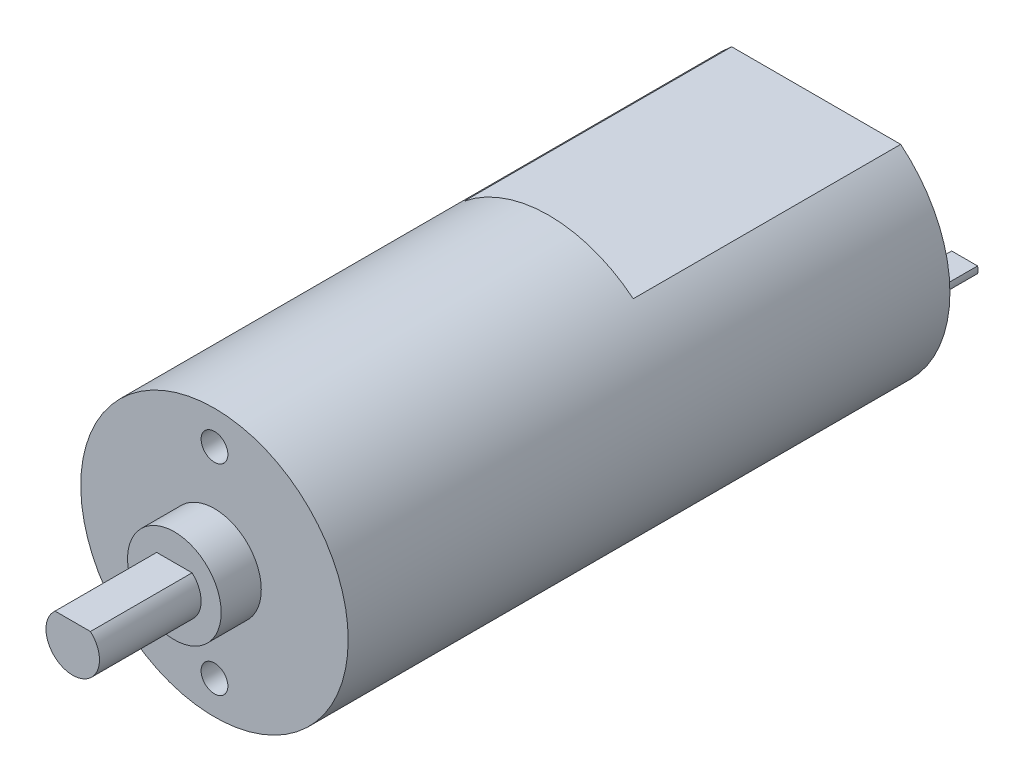
ISO-10303-21;
HEADER;
FILE_DESCRIPTION(('STEP AP214'),'2;1');
FILE_NAME('part.step','',(''),(''),'','','');
FILE_SCHEMA(('AUTOMOTIVE_DESIGN { 1 0 10303 214 1 1 1 1 }'));
ENDSEC;
DATA;
#1=APPLICATION_CONTEXT('core data for automotive mechanical design processes');
#2=APPLICATION_PROTOCOL_DEFINITION('international standard','automotive_design',2000,#1);
#3=PRODUCT_CONTEXT('',#1,'mechanical');
#4=PRODUCT('Part','Part','',(#3));
#5=PRODUCT_RELATED_PRODUCT_CATEGORY('part','',(#4));
#6=PRODUCT_DEFINITION_FORMATION('','',#4);
#7=PRODUCT_DEFINITION_CONTEXT('part definition',#1,'design');
#8=PRODUCT_DEFINITION('design','',#6,#7);
#9=PRODUCT_DEFINITION_SHAPE('','',#8);
#10=(LENGTH_UNIT() NAMED_UNIT(*) SI_UNIT(.MILLI.,.METRE.));
#11=(NAMED_UNIT(*) PLANE_ANGLE_UNIT() SI_UNIT($,.RADIAN.));
#12=(NAMED_UNIT(*) SI_UNIT($,.STERADIAN.) SOLID_ANGLE_UNIT());
#13=UNCERTAINTY_MEASURE_WITH_UNIT(LENGTH_MEASURE(1.E-05),#10,'distance_accuracy_value','');
#14=(GEOMETRIC_REPRESENTATION_CONTEXT(3) GLOBAL_UNCERTAINTY_ASSIGNED_CONTEXT((#13)) GLOBAL_UNIT_ASSIGNED_CONTEXT((#10,
#11,#12)) REPRESENTATION_CONTEXT('',''));
#15=CARTESIAN_POINT('',(0.,0.,0.));
#16=DIRECTION('',(0.,0.,1.));
#17=DIRECTION('',(1.,0.,0.));
#18=AXIS2_PLACEMENT_3D('',#15,#16,#17);
#19=CARTESIAN_POINT('',(-7.6,1.,-0.5));
#20=DIRECTION('',(0.,0.,-1.));
#21=DIRECTION('',(-1.,0.,0.));
#22=AXIS2_PLACEMENT_3D('',#19,#20,#21);
#23=PLANE('',#22);
#24=DIRECTION('',(-1.,0.,0.));
#25=VECTOR('',#24,1.);
#26=CARTESIAN_POINT('',(-6.63175416344814,0.75,-0.5));
#27=LINE('',#26,#25);
#28=CARTESIAN_POINT('',(-6.63175416344814,0.75,-0.5));
#29=VERTEX_POINT('',#28);
#30=CARTESIAN_POINT('',(-8.56824583655185,0.75,-0.5));
#31=VERTEX_POINT('',#30);
#32=EDGE_CURVE('E181',#29,#31,#27,.T.);
#33=ORIENTED_EDGE('',*,*,#32,.F.);
#34=CARTESIAN_POINT('',(-7.6,1.,-0.5));
#35=DIRECTION('',(0.,0.,-1.));
#36=DIRECTION('',(-1.,0.,0.));
#37=AXIS2_PLACEMENT_3D('',#34,#35,#36);
#38=CIRCLE('',#37,1.);
#39=EDGE_CURVE('E62',#29,#31,#38,.T.);
#40=ORIENTED_EDGE('',*,*,#39,.T.);
#41=EDGE_LOOP('',(#33,#40));
#42=FACE_BOUND('',#41,.T.);
#43=ADVANCED_FACE('F41',(#42),#23,.T.);
#44=CARTESIAN_POINT('',(7.6,-1.,-0.5));
#45=DIRECTION('',(0.,0.,-1.));
#46=DIRECTION('',(-1.,0.,0.));
#47=AXIS2_PLACEMENT_3D('',#44,#45,#46);
#48=PLANE('',#47);
#49=DIRECTION('',(-1.,0.,0.));
#50=VECTOR('',#49,1.);
#51=CARTESIAN_POINT('',(8.56824583655185,-1.25,-0.5));
#52=LINE('',#51,#50);
#53=CARTESIAN_POINT('',(8.56824583655185,-1.25,-0.5));
#54=VERTEX_POINT('',#53);
#55=CARTESIAN_POINT('',(6.63175416344815,-1.25,-0.5));
#56=VERTEX_POINT('',#55);
#57=EDGE_CURVE('E199',#54,#56,#52,.T.);
#58=ORIENTED_EDGE('',*,*,#57,.F.);
#59=CARTESIAN_POINT('',(7.6,-1.,-0.5));
#60=DIRECTION('',(0.,0.,-1.));
#61=DIRECTION('',(-1.,0.,0.));
#62=AXIS2_PLACEMENT_3D('',#59,#60,#61);
#63=CIRCLE('',#62,1.);
#64=EDGE_CURVE('E223',#54,#56,#63,.T.);
#65=ORIENTED_EDGE('',*,*,#64,.T.);
#66=EDGE_LOOP('',(#58,#65));
#67=FACE_BOUND('',#66,.T.);
#68=ADVANCED_FACE('F318',(#67),#48,.T.);
#69=CARTESIAN_POINT('',(-6.31961232988233,-7.75,20.));
#70=DIRECTION('',(0.,1.,0.));
#71=DIRECTION('',(-1.,0.,0.));
#72=AXIS2_PLACEMENT_3D('',#69,#70,#71);
#73=PLANE('',#72);
#74=DIRECTION('',(1.,0.,0.));
#75=VECTOR('',#74,1.);
#76=CARTESIAN_POINT('',(-6.31961232988233,-7.75,0.));
#77=LINE('',#76,#75);
#78=CARTESIAN_POINT('',(-6.31961232988233,-7.75,0.));
#79=VERTEX_POINT('',#78);
#80=CARTESIAN_POINT('',(6.31961232988233,-7.75,0.));
#81=VERTEX_POINT('',#80);
#82=EDGE_CURVE('E263',#79,#81,#77,.T.);
#83=ORIENTED_EDGE('',*,*,#82,.T.);
#84=DIRECTION('',(0.,0.,-1.));
#85=VECTOR('',#84,1.);
#86=CARTESIAN_POINT('',(6.31961232988233,-7.75,20.));
#87=LINE('',#86,#85);
#88=CARTESIAN_POINT('',(6.31961232988233,-7.75,20.));
#89=VERTEX_POINT('',#88);
#90=EDGE_CURVE('E273',#89,#81,#87,.T.);
#91=ORIENTED_EDGE('',*,*,#90,.F.);
#92=DIRECTION('',(1.,0.,0.));
#93=VECTOR('',#92,1.);
#94=CARTESIAN_POINT('',(-6.31961232988233,-7.75,20.));
#95=LINE('',#94,#93);
#96=CARTESIAN_POINT('',(-6.31961232988233,-7.75,20.));
#97=VERTEX_POINT('',#96);
#98=EDGE_CURVE('E253',#97,#89,#95,.T.);
#99=ORIENTED_EDGE('',*,*,#98,.F.);
#100=DIRECTION('',(0.,0.,-1.));
#101=VECTOR('',#100,1.);
#102=CARTESIAN_POINT('',(-6.31961232988233,-7.75,20.));
#103=LINE('',#102,#101);
#104=EDGE_CURVE('E233',#97,#79,#103,.T.);
#105=ORIENTED_EDGE('',*,*,#104,.T.);
#106=EDGE_LOOP('',(#83,#91,#99,#105));
#107=FACE_BOUND('',#106,.T.);
#108=ADVANCED_FACE('F43',(#107),#73,.F.);
#109=CARTESIAN_POINT('',(0.,0.,20.));
#110=DIRECTION('',(0.,0.,-1.));
#111=DIRECTION('',(-1.,0.,0.));
#112=AXIS2_PLACEMENT_3D('',#109,#110,#111);
#113=CYLINDRICAL_SURFACE('',#112,10.);
#114=CARTESIAN_POINT('',(0.,0.,0.));
#115=DIRECTION('',(0.,0.,1.));
#116=DIRECTION('',(1.,0.,0.));
#117=AXIS2_PLACEMENT_3D('',#114,#115,#116);
#118=CIRCLE('',#117,10.);
#119=CARTESIAN_POINT('',(6.31961232988233,7.75,0.));
#120=VERTEX_POINT('',#119);
#121=EDGE_CURVE('E265',#81,#120,#118,.T.);
#122=ORIENTED_EDGE('',*,*,#121,.T.);
#123=DIRECTION('',(0.,0.,-1.));
#124=VECTOR('',#123,1.);
#125=CARTESIAN_POINT('',(6.31961232988233,7.75,20.));
#126=LINE('',#125,#124);
#127=CARTESIAN_POINT('',(6.31961232988233,7.75,20.));
#128=VERTEX_POINT('',#127);
#129=EDGE_CURVE('E270',#128,#120,#126,.T.);
#130=ORIENTED_EDGE('',*,*,#129,.F.);
#131=CARTESIAN_POINT('',(0.,0.,20.));
#132=DIRECTION('',(0.,0.,1.));
#133=DIRECTION('',(1.,0.,0.));
#134=AXIS2_PLACEMENT_3D('',#131,#132,#133);
#135=CIRCLE('',#134,10.);
#136=CARTESIAN_POINT('',(-6.31961232988233,7.75,20.));
#137=VERTEX_POINT('',#136);
#138=EDGE_CURVE('E250',#128,#137,#135,.T.);
#139=ORIENTED_EDGE('',*,*,#138,.T.);
#140=DIRECTION('',(0.,0.,-1.));
#141=VECTOR('',#140,1.);
#142=CARTESIAN_POINT('',(-6.31961232988233,7.75,20.));
#143=LINE('',#142,#141);
#144=CARTESIAN_POINT('',(-6.31961232988233,7.75,0.));
#145=VERTEX_POINT('',#144);
#146=EDGE_CURVE('E260',#137,#145,#143,.T.);
#147=ORIENTED_EDGE('',*,*,#146,.T.);
#148=CARTESIAN_POINT('',(0.,0.,0.));
#149=DIRECTION('',(0.,0.,1.));
#150=DIRECTION('',(1.,0.,0.));
#151=AXIS2_PLACEMENT_3D('',#148,#149,#150);
#152=CIRCLE('',#151,10.);
#153=EDGE_CURVE('E249',#145,#79,#152,.T.);
#154=ORIENTED_EDGE('',*,*,#153,.T.);
#155=ORIENTED_EDGE('',*,*,#104,.F.);
#156=EDGE_CURVE('E237',#97,#89,#135,.T.);
#157=ORIENTED_EDGE('',*,*,#156,.T.);
#158=ORIENTED_EDGE('',*,*,#90,.T.);
#159=EDGE_LOOP('',(#122,#130,#139,#147,#154,#155,#157,#158));
#160=FACE_BOUND('',#159,.T.);
#161=CARTESIAN_POINT('',(0.,0.,45.));
#162=DIRECTION('',(0.,0.,1.));
#163=DIRECTION('',(1.,0.,0.));
#164=AXIS2_PLACEMENT_3D('',#161,#162,#163);
#165=CIRCLE('',#164,10.);
#166=CARTESIAN_POINT('',(10.,0.,45.));
#167=VERTEX_POINT('',#166);
#168=EDGE_CURVE('E246',#167,#167,#165,.T.);
#169=ORIENTED_EDGE('',*,*,#168,.F.);
#170=EDGE_LOOP('',(#169));
#171=FACE_BOUND('',#170,.T.);
#172=ADVANCED_FACE('F296',(#160,#171),#113,.T.);
#173=CARTESIAN_POINT('',(-6.31961232988233,7.75,20.));
#174=DIRECTION('',(0.,-1.,0.));
#175=DIRECTION('',(0.,0.,-1.));
#176=AXIS2_PLACEMENT_3D('',#173,#174,#175);
#177=PLANE('',#176);
#178=DIRECTION('',(-1.,0.,0.));
#179=VECTOR('',#178,1.);
#180=CARTESIAN_POINT('',(-6.31961232988233,7.75,0.));
#181=LINE('',#180,#179);
#182=EDGE_CURVE('E257',#120,#145,#181,.T.);
#183=ORIENTED_EDGE('',*,*,#182,.T.);
#184=ORIENTED_EDGE('',*,*,#146,.F.);
#185=DIRECTION('',(-1.,0.,0.));
#186=VECTOR('',#185,1.);
#187=CARTESIAN_POINT('',(-6.31961232988233,7.75,20.));
#188=LINE('',#187,#186);
#189=EDGE_CURVE('E256',#128,#137,#188,.T.);
#190=ORIENTED_EDGE('',*,*,#189,.F.);
#191=ORIENTED_EDGE('',*,*,#129,.T.);
#192=EDGE_LOOP('',(#183,#184,#190,#191));
#193=FACE_BOUND('',#192,.T.);
#194=ADVANCED_FACE('F286',(#193),#177,.F.);
#195=CARTESIAN_POINT('',(0.,0.,0.));
#196=DIRECTION('',(0.,0.,1.));
#197=DIRECTION('',(1.,0.,0.));
#198=AXIS2_PLACEMENT_3D('',#195,#196,#197);
#199=PLANE('',#198);
#200=CARTESIAN_POINT('',(-7.6,1.,0.));
#201=DIRECTION('',(0.,0.,1.));
#202=DIRECTION('',(1.,0.,0.));
#203=AXIS2_PLACEMENT_3D('',#200,#201,#202);
#204=CIRCLE('',#203,1.);
#205=CARTESIAN_POINT('',(-6.6,1.,0.));
#206=VERTEX_POINT('',#205);
#207=EDGE_CURVE('E11',#206,#206,#204,.F.);
#208=ORIENTED_EDGE('',*,*,#207,.F.);
#209=EDGE_LOOP('',(#208));
#210=FACE_BOUND('',#209,.T.);
#211=CARTESIAN_POINT('',(7.6,-1.,0.));
#212=DIRECTION('',(0.,0.,1.));
#213=DIRECTION('',(1.,0.,0.));
#214=AXIS2_PLACEMENT_3D('',#211,#212,#213);
#215=CIRCLE('',#214,1.);
#216=CARTESIAN_POINT('',(8.6,-1.,0.));
#217=VERTEX_POINT('',#216);
#218=EDGE_CURVE('E49',#217,#217,#215,.F.);
#219=ORIENTED_EDGE('',*,*,#218,.F.);
#220=EDGE_LOOP('',(#219));
#221=FACE_BOUND('',#220,.T.);
#222=CARTESIAN_POINT('',(0.,0.,0.));
#223=DIRECTION('',(0.,0.,-1.));
#224=DIRECTION('',(-1.,0.,0.));
#225=AXIS2_PLACEMENT_3D('',#222,#223,#224);
#226=CIRCLE('',#225,3.);
#227=CARTESIAN_POINT('',(-3.,0.,0.));
#228=VERTEX_POINT('',#227);
#229=EDGE_CURVE('E230',#228,#228,#226,.T.);
#230=ORIENTED_EDGE('',*,*,#229,.F.);
#231=EDGE_LOOP('',(#230));
#232=FACE_BOUND('',#231,.T.);
#233=ORIENTED_EDGE('',*,*,#153,.F.);
#234=ORIENTED_EDGE('',*,*,#182,.F.);
#235=ORIENTED_EDGE('',*,*,#121,.F.);
#236=ORIENTED_EDGE('',*,*,#82,.F.);
#237=EDGE_LOOP('',(#233,#234,#235,#236));
#238=FACE_BOUND('',#237,.T.);
#239=ADVANCED_FACE('F282',(#210,#221,#232,#238),#199,.F.);
#240=CARTESIAN_POINT('',(0.,0.,20.));
#241=DIRECTION('',(0.,0.,1.));
#242=DIRECTION('',(1.,0.,0.));
#243=AXIS2_PLACEMENT_3D('',#240,#241,#242);
#244=PLANE('',#243);
#245=ORIENTED_EDGE('',*,*,#156,.F.);
#246=ORIENTED_EDGE('',*,*,#98,.T.);
#247=EDGE_LOOP('',(#245,#246));
#248=FACE_BOUND('',#247,.T.);
#249=ADVANCED_FACE('F285',(#248),#244,.F.);
#250=ORIENTED_EDGE('',*,*,#138,.F.);
#251=ORIENTED_EDGE('',*,*,#189,.T.);
#252=EDGE_LOOP('',(#250,#251));
#253=FACE_BOUND('',#252,.T.);
#254=ADVANCED_FACE('F304',(#253),#244,.F.);
#255=CARTESIAN_POINT('',(0.,0.,45.));
#256=DIRECTION('',(0.,0.,1.));
#257=DIRECTION('',(1.,0.,0.));
#258=AXIS2_PLACEMENT_3D('',#255,#256,#257);
#259=PLANE('',#258);
#260=CARTESIAN_POINT('',(0.,0.,45.));
#261=DIRECTION('',(0.,0.,1.));
#262=DIRECTION('',(1.,0.,0.));
#263=AXIS2_PLACEMENT_3D('',#260,#261,#262);
#264=CIRCLE('',#263,3.5);
#265=CARTESIAN_POINT('',(3.5,0.,45.));
#266=VERTEX_POINT('',#265);
#267=EDGE_CURVE('E158',#266,#266,#264,.T.);
#268=ORIENTED_EDGE('',*,*,#267,.F.);
#269=EDGE_LOOP('',(#268));
#270=FACE_BOUND('',#269,.T.);
#271=CARTESIAN_POINT('',(0.,7.5,45.));
#272=DIRECTION('',(0.,0.,1.));
#273=DIRECTION('',(1.,0.,0.));
#274=AXIS2_PLACEMENT_3D('',#271,#272,#273);
#275=CIRCLE('',#274,1.);
#276=CARTESIAN_POINT('',(0.999999999999999,7.5,45.));
#277=VERTEX_POINT('',#276);
#278=EDGE_CURVE('E238',#277,#277,#275,.T.);
#279=ORIENTED_EDGE('',*,*,#278,.F.);
#280=EDGE_LOOP('',(#279));
#281=FACE_BOUND('',#280,.T.);
#282=CARTESIAN_POINT('',(0.,-7.5,45.));
#283=DIRECTION('',(0.,0.,1.));
#284=DIRECTION('',(1.,0.,0.));
#285=AXIS2_PLACEMENT_3D('',#282,#283,#284);
#286=CIRCLE('',#285,1.);
#287=CARTESIAN_POINT('',(1.,-7.5,45.));
#288=VERTEX_POINT('',#287);
#289=EDGE_CURVE('E241',#288,#288,#286,.T.);
#290=ORIENTED_EDGE('',*,*,#289,.F.);
#291=EDGE_LOOP('',(#290));
#292=FACE_BOUND('',#291,.T.);
#293=ORIENTED_EDGE('',*,*,#168,.T.);
#294=EDGE_LOOP('',(#293));
#295=FACE_BOUND('',#294,.T.);
#296=ADVANCED_FACE('F306',(#270,#281,#292,#295),#259,.T.);
#297=CARTESIAN_POINT('',(0.,-7.5,41.));
#298=DIRECTION('',(0.,0.,1.));
#299=DIRECTION('',(1.,0.,0.));
#300=AXIS2_PLACEMENT_3D('',#297,#298,#299);
#301=CYLINDRICAL_SURFACE('',#300,1.);
#302=CARTESIAN_POINT('',(0.,-7.5,41.));
#303=DIRECTION('',(0.,0.,1.));
#304=DIRECTION('',(1.,0.,0.));
#305=AXIS2_PLACEMENT_3D('',#302,#303,#304);
#306=CIRCLE('',#305,1.);
#307=CARTESIAN_POINT('',(1.,-7.5,41.));
#308=VERTEX_POINT('',#307);
#309=EDGE_CURVE('E229',#308,#308,#306,.T.);
#310=ORIENTED_EDGE('',*,*,#309,.F.);
#311=EDGE_LOOP('',(#310));
#312=FACE_BOUND('',#311,.T.);
#313=ORIENTED_EDGE('',*,*,#289,.T.);
#314=EDGE_LOOP('',(#313));
#315=FACE_BOUND('',#314,.T.);
#316=ADVANCED_FACE('F313',(#312,#315),#301,.F.);
#317=CARTESIAN_POINT('',(0.,-7.5,41.));
#318=DIRECTION('',(0.,0.,1.));
#319=DIRECTION('',(1.,0.,0.));
#320=AXIS2_PLACEMENT_3D('',#317,#318,#319);
#321=PLANE('',#320);
#322=ORIENTED_EDGE('',*,*,#309,.T.);
#323=EDGE_LOOP('',(#322));
#324=FACE_BOUND('',#323,.T.);
#325=ADVANCED_FACE('F406',(#324),#321,.T.);
#326=CARTESIAN_POINT('',(0.,7.5,41.));
#327=DIRECTION('',(0.,0.,1.));
#328=DIRECTION('',(1.,0.,0.));
#329=AXIS2_PLACEMENT_3D('',#326,#327,#328);
#330=CYLINDRICAL_SURFACE('',#329,1.);
#331=CARTESIAN_POINT('',(0.,7.5,41.));
#332=DIRECTION('',(0.,0.,1.));
#333=DIRECTION('',(1.,0.,0.));
#334=AXIS2_PLACEMENT_3D('',#331,#332,#333);
#335=CIRCLE('',#334,1.);
#336=CARTESIAN_POINT('',(0.999999999999999,7.5,41.));
#337=VERTEX_POINT('',#336);
#338=EDGE_CURVE('E234',#337,#337,#335,.T.);
#339=ORIENTED_EDGE('',*,*,#338,.F.);
#340=EDGE_LOOP('',(#339));
#341=FACE_BOUND('',#340,.T.);
#342=ORIENTED_EDGE('',*,*,#278,.T.);
#343=EDGE_LOOP('',(#342));
#344=FACE_BOUND('',#343,.T.);
#345=ADVANCED_FACE('F402',(#341,#344),#330,.F.);
#346=CARTESIAN_POINT('',(0.,7.5,41.));
#347=DIRECTION('',(0.,0.,1.));
#348=DIRECTION('',(1.,0.,0.));
#349=AXIS2_PLACEMENT_3D('',#346,#347,#348);
#350=PLANE('',#349);
#351=ORIENTED_EDGE('',*,*,#338,.T.);
#352=EDGE_LOOP('',(#351));
#353=FACE_BOUND('',#352,.T.);
#354=ADVANCED_FACE('F398',(#353),#350,.T.);
#355=CARTESIAN_POINT('',(0.,0.,-2.));
#356=DIRECTION('',(0.,0.,1.));
#357=DIRECTION('',(1.,0.,0.));
#358=AXIS2_PLACEMENT_3D('',#355,#356,#357);
#359=CYLINDRICAL_SURFACE('',#358,3.);
#360=CARTESIAN_POINT('',(0.,0.,-2.));
#361=DIRECTION('',(0.,0.,-1.));
#362=DIRECTION('',(-1.,0.,0.));
#363=AXIS2_PLACEMENT_3D('',#360,#361,#362);
#364=CIRCLE('',#363,3.);
#365=CARTESIAN_POINT('',(-3.,0.,-2.));
#366=VERTEX_POINT('',#365);
#367=EDGE_CURVE('E226',#366,#366,#364,.T.);
#368=ORIENTED_EDGE('',*,*,#367,.F.);
#369=EDGE_LOOP('',(#368));
#370=FACE_BOUND('',#369,.T.);
#371=ORIENTED_EDGE('',*,*,#229,.T.);
#372=EDGE_LOOP('',(#371));
#373=FACE_BOUND('',#372,.T.);
#374=ADVANCED_FACE('F394',(#370,#373),#359,.T.);
#375=CARTESIAN_POINT('',(0.,0.,-2.));
#376=DIRECTION('',(0.,0.,-1.));
#377=DIRECTION('',(-1.,0.,0.));
#378=AXIS2_PLACEMENT_3D('',#375,#376,#377);
#379=PLANE('',#378);
#380=ORIENTED_EDGE('',*,*,#367,.T.);
#381=EDGE_LOOP('',(#380));
#382=FACE_BOUND('',#381,.T.);
#383=ADVANCED_FACE('F389',(#382),#379,.T.);
#384=CARTESIAN_POINT('',(7.6,-1.,-0.5));
#385=DIRECTION('',(0.,0.,1.));
#386=DIRECTION('',(1.,0.,0.));
#387=AXIS2_PLACEMENT_3D('',#384,#385,#386);
#388=CYLINDRICAL_SURFACE('',#387,1.);
#389=CARTESIAN_POINT('',(6.63175416344815,-0.75,-0.5));
#390=VERTEX_POINT('',#389);
#391=CARTESIAN_POINT('',(8.56824583655185,-0.75,-0.5));
#392=VERTEX_POINT('',#391);
#393=EDGE_CURVE('E224',#390,#392,#63,.T.);
#394=ORIENTED_EDGE('',*,*,#393,.F.);
#395=DIRECTION('',(0.,0.,1.));
#396=VECTOR('',#395,1.);
#397=CARTESIAN_POINT('',(6.63175416344815,-0.75,-3.5));
#398=LINE('',#397,#396);
#399=CARTESIAN_POINT('',(6.63175416344815,-0.75,-3.5));
#400=VERTEX_POINT('',#399);
#401=EDGE_CURVE('E218',#400,#390,#398,.T.);
#402=ORIENTED_EDGE('',*,*,#401,.F.);
#403=CARTESIAN_POINT('',(7.6,-1.,-3.5));
#404=DIRECTION('',(0.,0.,-1.));
#405=DIRECTION('',(1.,0.,0.));
#406=AXIS2_PLACEMENT_3D('',#403,#404,#405);
#407=CIRCLE('',#406,1.);
#408=CARTESIAN_POINT('',(6.63175416344815,-1.25,-3.5));
#409=VERTEX_POINT('',#408);
#410=EDGE_CURVE('E195',#409,#400,#407,.T.);
#411=ORIENTED_EDGE('',*,*,#410,.F.);
#412=DIRECTION('',(0.,0.,1.));
#413=VECTOR('',#412,1.);
#414=CARTESIAN_POINT('',(6.63175416344815,-1.25,-3.5));
#415=LINE('',#414,#413);
#416=EDGE_CURVE('E205',#409,#56,#415,.T.);
#417=ORIENTED_EDGE('',*,*,#416,.T.);
#418=ORIENTED_EDGE('',*,*,#64,.F.);
#419=DIRECTION('',(0.,0.,1.));
#420=VECTOR('',#419,1.);
#421=CARTESIAN_POINT('',(8.56824583655185,-1.25,-3.5));
#422=LINE('',#421,#420);
#423=CARTESIAN_POINT('',(8.56824583655185,-1.25,-3.5));
#424=VERTEX_POINT('',#423);
#425=EDGE_CURVE('E212',#424,#54,#422,.T.);
#426=ORIENTED_EDGE('',*,*,#425,.F.);
#427=CARTESIAN_POINT('',(7.6,-1.,-3.5));
#428=DIRECTION('',(0.,0.,-1.));
#429=DIRECTION('',(-1.,0.,0.));
#430=AXIS2_PLACEMENT_3D('',#427,#428,#429);
#431=CIRCLE('',#430,1.);
#432=CARTESIAN_POINT('',(8.56824583655185,-0.75,-3.5));
#433=VERTEX_POINT('',#432);
#434=EDGE_CURVE('E201',#433,#424,#431,.T.);
#435=ORIENTED_EDGE('',*,*,#434,.F.);
#436=DIRECTION('',(0.,0.,1.));
#437=VECTOR('',#436,1.);
#438=CARTESIAN_POINT('',(8.56824583655185,-0.75,-3.5));
#439=LINE('',#438,#437);
#440=EDGE_CURVE('E215',#433,#392,#439,.T.);
#441=ORIENTED_EDGE('',*,*,#440,.T.);
#442=EDGE_LOOP('',(#394,#402,#411,#417,#418,#426,#435,#441));
#443=FACE_BOUND('',#442,.T.);
#444=ORIENTED_EDGE('',*,*,#218,.T.);
#445=EDGE_LOOP('',(#444));
#446=FACE_BOUND('',#445,.T.);
#447=ADVANCED_FACE('F280',(#443,#446),#388,.T.);
#448=DIRECTION('',(1.,0.,0.));
#449=VECTOR('',#448,1.);
#450=CARTESIAN_POINT('',(8.56824583655185,-0.75,-0.5));
#451=LINE('',#450,#449);
#452=EDGE_CURVE('E187',#390,#392,#451,.T.);
#453=ORIENTED_EDGE('',*,*,#452,.F.);
#454=ORIENTED_EDGE('',*,*,#393,.T.);
#455=EDGE_LOOP('',(#453,#454));
#456=FACE_BOUND('',#455,.T.);
#457=ADVANCED_FACE('F326',(#456),#48,.T.);
#458=CARTESIAN_POINT('',(-7.6,1.,-0.5));
#459=DIRECTION('',(0.,0.,1.));
#460=DIRECTION('',(1.,0.,0.));
#461=AXIS2_PLACEMENT_3D('',#458,#459,#460);
#462=CYLINDRICAL_SURFACE('',#461,1.);
#463=CARTESIAN_POINT('',(-8.56824583655185,1.25,-0.5));
#464=VERTEX_POINT('',#463);
#465=CARTESIAN_POINT('',(-6.63175416344815,1.25,-0.5));
#466=VERTEX_POINT('',#465);
#467=EDGE_CURVE('E221',#464,#466,#38,.T.);
#468=ORIENTED_EDGE('',*,*,#467,.F.);
#469=DIRECTION('',(0.,0.,1.));
#470=VECTOR('',#469,1.);
#471=CARTESIAN_POINT('',(-8.56824583655186,1.25,-3.5));
#472=LINE('',#471,#470);
#473=CARTESIAN_POINT('',(-8.56824583655186,1.25,-3.5));
#474=VERTEX_POINT('',#473);
#475=EDGE_CURVE('E167',#474,#464,#472,.T.);
#476=ORIENTED_EDGE('',*,*,#475,.F.);
#477=CARTESIAN_POINT('',(-7.6,1.,-3.5));
#478=DIRECTION('',(0.,0.,-1.));
#479=DIRECTION('',(1.,0.,0.));
#480=AXIS2_PLACEMENT_3D('',#477,#478,#479);
#481=CIRCLE('',#480,1.);
#482=CARTESIAN_POINT('',(-8.56824583655185,0.75,-3.5));
#483=VERTEX_POINT('',#482);
#484=EDGE_CURVE('E184',#483,#474,#481,.T.);
#485=ORIENTED_EDGE('',*,*,#484,.F.);
#486=DIRECTION('',(0.,0.,1.));
#487=VECTOR('',#486,1.);
#488=CARTESIAN_POINT('',(-8.56824583655185,0.75,-3.5));
#489=LINE('',#488,#487);
#490=EDGE_CURVE('E177',#483,#31,#489,.T.);
#491=ORIENTED_EDGE('',*,*,#490,.T.);
#492=ORIENTED_EDGE('',*,*,#39,.F.);
#493=DIRECTION('',(0.,0.,1.));
#494=VECTOR('',#493,1.);
#495=CARTESIAN_POINT('',(-6.63175416344814,0.750000000000001,-3.5));
#496=LINE('',#495,#494);
#497=CARTESIAN_POINT('',(-6.63175416344814,0.750000000000001,-3.5));
#498=VERTEX_POINT('',#497);
#499=EDGE_CURVE('E174',#498,#29,#496,.T.);
#500=ORIENTED_EDGE('',*,*,#499,.F.);
#501=CARTESIAN_POINT('',(-7.6,1.,-3.5));
#502=DIRECTION('',(0.,0.,-1.));
#503=DIRECTION('',(-1.,0.,0.));
#504=AXIS2_PLACEMENT_3D('',#501,#502,#503);
#505=CIRCLE('',#504,1.);
#506=CARTESIAN_POINT('',(-6.63175416344815,1.25,-3.5));
#507=VERTEX_POINT('',#506);
#508=EDGE_CURVE('E189',#507,#498,#505,.T.);
#509=ORIENTED_EDGE('',*,*,#508,.F.);
#510=DIRECTION('',(0.,0.,1.));
#511=VECTOR('',#510,1.);
#512=CARTESIAN_POINT('',(-6.63175416344815,1.25,-3.5));
#513=LINE('',#512,#511);
#514=EDGE_CURVE('E171',#507,#466,#513,.T.);
#515=ORIENTED_EDGE('',*,*,#514,.T.);
#516=EDGE_LOOP('',(#468,#476,#485,#491,#492,#500,#509,#515));
#517=FACE_BOUND('',#516,.T.);
#518=ORIENTED_EDGE('',*,*,#207,.T.);
#519=EDGE_LOOP('',(#518));
#520=FACE_BOUND('',#519,.T.);
#521=ADVANCED_FACE('F330',(#517,#520),#462,.T.);
#522=DIRECTION('',(1.,0.,0.));
#523=VECTOR('',#522,1.);
#524=CARTESIAN_POINT('',(-6.63175416344815,1.25,-0.5));
#525=LINE('',#524,#523);
#526=EDGE_CURVE('E183',#464,#466,#525,.T.);
#527=ORIENTED_EDGE('',*,*,#526,.F.);
#528=ORIENTED_EDGE('',*,*,#467,.T.);
#529=EDGE_LOOP('',(#527,#528));
#530=FACE_BOUND('',#529,.T.);
#531=ADVANCED_FACE('F320',(#530),#23,.T.);
#532=CARTESIAN_POINT('',(8.56824583655185,-0.75,-3.5));
#533=DIRECTION('',(0.,-1.,0.));
#534=DIRECTION('',(0.,0.,-1.));
#535=AXIS2_PLACEMENT_3D('',#532,#533,#534);
#536=PLANE('',#535);
#537=ORIENTED_EDGE('',*,*,#452,.T.);
#538=ORIENTED_EDGE('',*,*,#440,.F.);
#539=DIRECTION('',(1.,0.,0.));
#540=VECTOR('',#539,1.);
#541=CARTESIAN_POINT('',(8.56824583655185,-0.75,-3.5));
#542=LINE('',#541,#540);
#543=EDGE_CURVE('E198',#400,#433,#542,.T.);
#544=ORIENTED_EDGE('',*,*,#543,.F.);
#545=ORIENTED_EDGE('',*,*,#401,.T.);
#546=EDGE_LOOP('',(#537,#538,#544,#545));
#547=FACE_BOUND('',#546,.T.);
#548=ADVANCED_FACE('F329',(#547),#536,.F.);
#549=CARTESIAN_POINT('',(8.56824583655185,-1.25,-3.5));
#550=DIRECTION('',(0.,1.,0.));
#551=DIRECTION('',(0.,0.,1.));
#552=AXIS2_PLACEMENT_3D('',#549,#550,#551);
#553=PLANE('',#552);
#554=ORIENTED_EDGE('',*,*,#57,.T.);
#555=ORIENTED_EDGE('',*,*,#416,.F.);
#556=DIRECTION('',(-1.,0.,0.));
#557=VECTOR('',#556,1.);
#558=CARTESIAN_POINT('',(8.56824583655185,-1.25,-3.5));
#559=LINE('',#558,#557);
#560=EDGE_CURVE('E203',#424,#409,#559,.T.);
#561=ORIENTED_EDGE('',*,*,#560,.F.);
#562=ORIENTED_EDGE('',*,*,#425,.T.);
#563=EDGE_LOOP('',(#554,#555,#561,#562));
#564=FACE_BOUND('',#563,.T.);
#565=ADVANCED_FACE('F336',(#564),#553,.F.);
#566=CARTESIAN_POINT('',(7.6,-1.,-3.5));
#567=DIRECTION('',(0.,0.,1.));
#568=DIRECTION('',(1.,0.,0.));
#569=AXIS2_PLACEMENT_3D('',#566,#567,#568);
#570=PLANE('',#569);
#571=ORIENTED_EDGE('',*,*,#410,.T.);
#572=ORIENTED_EDGE('',*,*,#543,.T.);
#573=ORIENTED_EDGE('',*,*,#434,.T.);
#574=ORIENTED_EDGE('',*,*,#560,.T.);
#575=EDGE_LOOP('',(#571,#572,#573,#574));
#576=FACE_BOUND('',#575,.T.);
#577=ADVANCED_FACE('F363',(#576),#570,.F.);
#578=CARTESIAN_POINT('',(-6.63175416344815,1.25,-3.5));
#579=DIRECTION('',(0.,-1.,0.));
#580=DIRECTION('',(1.,0.,0.));
#581=AXIS2_PLACEMENT_3D('',#578,#579,#580);
#582=PLANE('',#581);
#583=ORIENTED_EDGE('',*,*,#526,.T.);
#584=ORIENTED_EDGE('',*,*,#514,.F.);
#585=DIRECTION('',(1.,0.,0.));
#586=VECTOR('',#585,1.);
#587=CARTESIAN_POINT('',(-6.63175416344815,1.25,-3.5));
#588=LINE('',#587,#586);
#589=EDGE_CURVE('E191',#474,#507,#588,.T.);
#590=ORIENTED_EDGE('',*,*,#589,.F.);
#591=ORIENTED_EDGE('',*,*,#475,.T.);
#592=EDGE_LOOP('',(#583,#584,#590,#591));
#593=FACE_BOUND('',#592,.T.);
#594=ADVANCED_FACE('F347',(#593),#582,.F.);
#595=CARTESIAN_POINT('',(-6.63175416344814,0.75,-3.5));
#596=DIRECTION('',(0.,1.,0.));
#597=DIRECTION('',(0.,0.,1.));
#598=AXIS2_PLACEMENT_3D('',#595,#596,#597);
#599=PLANE('',#598);
#600=ORIENTED_EDGE('',*,*,#32,.T.);
#601=ORIENTED_EDGE('',*,*,#490,.F.);
#602=DIRECTION('',(-1.,0.,0.));
#603=VECTOR('',#602,1.);
#604=CARTESIAN_POINT('',(-6.63175416344814,0.75,-3.5));
#605=LINE('',#604,#603);
#606=EDGE_CURVE('E180',#498,#483,#605,.T.);
#607=ORIENTED_EDGE('',*,*,#606,.F.);
#608=ORIENTED_EDGE('',*,*,#499,.T.);
#609=EDGE_LOOP('',(#600,#601,#607,#608));
#610=FACE_BOUND('',#609,.T.);
#611=ADVANCED_FACE('F354',(#610),#599,.F.);
#612=CARTESIAN_POINT('',(-7.6,1.,-3.5));
#613=DIRECTION('',(0.,0.,1.));
#614=DIRECTION('',(1.,0.,0.));
#615=AXIS2_PLACEMENT_3D('',#612,#613,#614);
#616=PLANE('',#615);
#617=ORIENTED_EDGE('',*,*,#484,.T.);
#618=ORIENTED_EDGE('',*,*,#589,.T.);
#619=ORIENTED_EDGE('',*,*,#508,.T.);
#620=ORIENTED_EDGE('',*,*,#606,.T.);
#621=EDGE_LOOP('',(#617,#618,#619,#620));
#622=FACE_BOUND('',#621,.T.);
#623=ADVANCED_FACE('F349',(#622),#616,.F.);
#624=CARTESIAN_POINT('',(0.,0.,48.));
#625=DIRECTION('',(0.,0.,-1.));
#626=DIRECTION('',(-1.,0.,0.));
#627=AXIS2_PLACEMENT_3D('',#624,#625,#626);
#628=CYLINDRICAL_SURFACE('',#627,3.5);
#629=CARTESIAN_POINT('',(0.,0.,48.));
#630=DIRECTION('',(0.,0.,1.));
#631=DIRECTION('',(1.,0.,0.));
#632=AXIS2_PLACEMENT_3D('',#629,#630,#631);
#633=CIRCLE('',#632,3.5);
#634=CARTESIAN_POINT('',(3.5,0.,48.));
#635=VERTEX_POINT('',#634);
#636=EDGE_CURVE('E161',#635,#635,#633,.T.);
#637=ORIENTED_EDGE('',*,*,#636,.F.);
#638=EDGE_LOOP('',(#637));
#639=FACE_BOUND('',#638,.T.);
#640=ORIENTED_EDGE('',*,*,#267,.T.);
#641=EDGE_LOOP('',(#640));
#642=FACE_BOUND('',#641,.T.);
#643=ADVANCED_FACE('F361',(#639,#642),#628,.T.);
#644=CARTESIAN_POINT('',(0.,0.,48.));
#645=DIRECTION('',(0.,0.,1.));
#646=DIRECTION('',(1.,0.,0.));
#647=AXIS2_PLACEMENT_3D('',#644,#645,#646);
#648=PLANE('',#647);
#649=CARTESIAN_POINT('',(0.,0.,48.));
#650=DIRECTION('',(0.,0.,1.));
#651=DIRECTION('',(1.,0.,0.));
#652=AXIS2_PLACEMENT_3D('',#649,#650,#651);
#653=CIRCLE('',#652,2.);
#654=CARTESIAN_POINT('',(-1.3228756555323,1.5,48.));
#655=VERTEX_POINT('',#654);
#656=CARTESIAN_POINT('',(1.3228756555323,1.5,48.));
#657=VERTEX_POINT('',#656);
#658=EDGE_CURVE('E157',#655,#657,#653,.T.);
#659=ORIENTED_EDGE('',*,*,#658,.F.);
#660=DIRECTION('',(-1.,0.,0.));
#661=VECTOR('',#660,1.);
#662=CARTESIAN_POINT('',(-1.3228756555323,1.5,48.));
#663=LINE('',#662,#661);
#664=EDGE_CURVE('E55',#657,#655,#663,.T.);
#665=ORIENTED_EDGE('',*,*,#664,.F.);
#666=EDGE_LOOP('',(#659,#665));
#667=FACE_BOUND('',#666,.T.);
#668=ORIENTED_EDGE('',*,*,#636,.T.);
#669=EDGE_LOOP('',(#668));
#670=FACE_BOUND('',#669,.T.);
#671=ADVANCED_FACE('F509',(#667,#670),#648,.T.);
#672=CARTESIAN_POINT('',(0.,0.,55.6));
#673=DIRECTION('',(0.,0.,-1.));
#674=DIRECTION('',(-1.,0.,0.));
#675=AXIS2_PLACEMENT_3D('',#672,#673,#674);
#676=CYLINDRICAL_SURFACE('',#675,2.);
#677=ORIENTED_EDGE('',*,*,#658,.T.);
#678=DIRECTION('',(0.,0.,-1.));
#679=VECTOR('',#678,1.);
#680=CARTESIAN_POINT('',(1.3228756555323,1.5,55.6));
#681=LINE('',#680,#679);
#682=CARTESIAN_POINT('',(1.3228756555323,1.5,55.6));
#683=VERTEX_POINT('',#682);
#684=EDGE_CURVE('E145',#683,#657,#681,.T.);
#685=ORIENTED_EDGE('',*,*,#684,.F.);
#686=CARTESIAN_POINT('',(0.,0.,55.6));
#687=DIRECTION('',(0.,0.,1.));
#688=DIRECTION('',(1.,0.,0.));
#689=AXIS2_PLACEMENT_3D('',#686,#687,#688);
#690=CIRCLE('',#689,2.);
#691=CARTESIAN_POINT('',(-1.3228756555323,1.5,55.6));
#692=VERTEX_POINT('',#691);
#693=EDGE_CURVE('E151',#692,#683,#690,.T.);
#694=ORIENTED_EDGE('',*,*,#693,.F.);
#695=DIRECTION('',(0.,0.,-1.));
#696=VECTOR('',#695,1.);
#697=CARTESIAN_POINT('',(-1.3228756555323,1.5,55.6));
#698=LINE('',#697,#696);
#699=EDGE_CURVE('E148',#692,#655,#698,.T.);
#700=ORIENTED_EDGE('',*,*,#699,.T.);
#701=EDGE_LOOP('',(#677,#685,#694,#700));
#702=FACE_BOUND('',#701,.T.);
#703=ADVANCED_FACE('F156',(#702),#676,.T.);
#704=CARTESIAN_POINT('',(-1.3228756555323,1.5,55.6));
#705=DIRECTION('',(0.,-1.,0.));
#706=DIRECTION('',(0.,0.,-1.));
#707=AXIS2_PLACEMENT_3D('',#704,#705,#706);
#708=PLANE('',#707);
#709=ORIENTED_EDGE('',*,*,#664,.T.);
#710=ORIENTED_EDGE('',*,*,#699,.F.);
#711=DIRECTION('',(-1.,0.,0.));
#712=VECTOR('',#711,1.);
#713=CARTESIAN_POINT('',(-1.3228756555323,1.5,55.6));
#714=LINE('',#713,#712);
#715=EDGE_CURVE('E141',#683,#692,#714,.T.);
#716=ORIENTED_EDGE('',*,*,#715,.F.);
#717=ORIENTED_EDGE('',*,*,#684,.T.);
#718=EDGE_LOOP('',(#709,#710,#716,#717));
#719=FACE_BOUND('',#718,.T.);
#720=ADVANCED_FACE('F143',(#719),#708,.F.);
#721=CARTESIAN_POINT('',(0.,0.,55.6));
#722=DIRECTION('',(0.,0.,1.));
#723=DIRECTION('',(1.,0.,0.));
#724=AXIS2_PLACEMENT_3D('',#721,#722,#723);
#725=PLANE('',#724);
#726=ORIENTED_EDGE('',*,*,#693,.T.);
#727=ORIENTED_EDGE('',*,*,#715,.T.);
#728=EDGE_LOOP('',(#726,#727));
#729=FACE_BOUND('',#728,.T.);
#730=ADVANCED_FACE('F153',(#729),#725,.T.);
#731=CLOSED_SHELL('',(#43,#68,#108,#172,#194,#239,#249,#254,#296,#316,#325,#345,#354,#374,#383,
#447,#457,#521,#531,#548,#565,#577,#594,#611,#623,#643,#671,#703,#720,#730));
#732=MANIFOLD_SOLID_BREP('B2',#731);
#733=ADVANCED_BREP_SHAPE_REPRESENTATION('',(#18,#732),#14);
#734=SHAPE_DEFINITION_REPRESENTATION(#9,#733);
ENDSEC;
END-ISO-10303-21;
